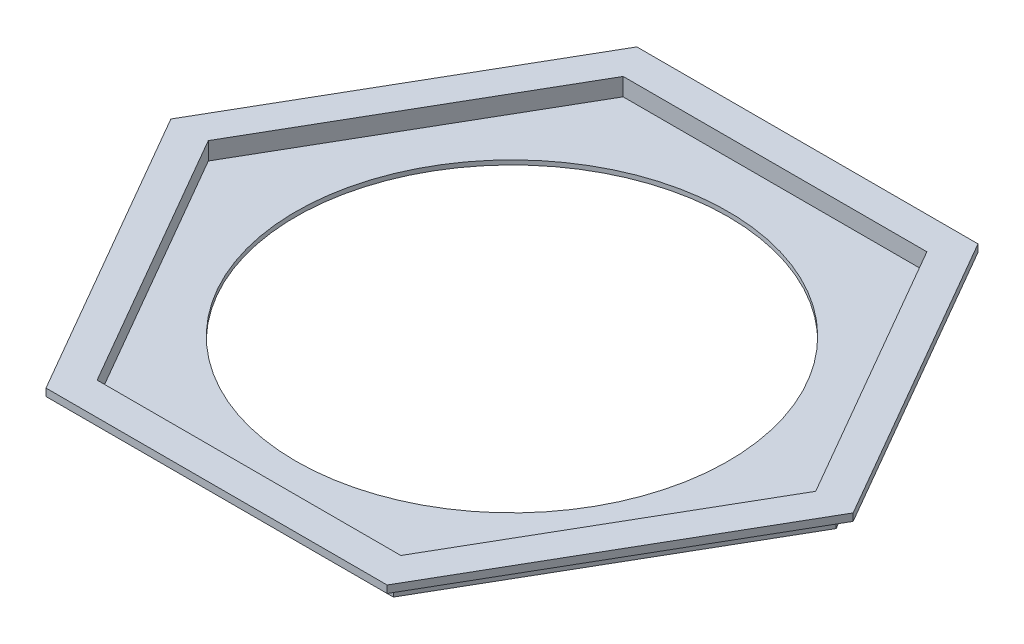
ISO-10303-21;
HEADER;
FILE_DESCRIPTION(('STEP AP214'),'2;1');
FILE_NAME('part.step','',(''),(''),'','','');
FILE_SCHEMA(('AUTOMOTIVE_DESIGN { 1 0 10303 214 1 1 1 1 }'));
ENDSEC;
DATA;
#1=APPLICATION_CONTEXT('core data for automotive mechanical design processes');
#2=APPLICATION_PROTOCOL_DEFINITION('international standard','automotive_design',2000,#1);
#3=PRODUCT_CONTEXT('',#1,'mechanical');
#4=PRODUCT('Part','Part','',(#3));
#5=PRODUCT_RELATED_PRODUCT_CATEGORY('part','',(#4));
#6=PRODUCT_DEFINITION_FORMATION('','',#4);
#7=PRODUCT_DEFINITION_CONTEXT('part definition',#1,'design');
#8=PRODUCT_DEFINITION('design','',#6,#7);
#9=PRODUCT_DEFINITION_SHAPE('','',#8);
#10=(LENGTH_UNIT() NAMED_UNIT(*) SI_UNIT(.MILLI.,.METRE.));
#11=(NAMED_UNIT(*) PLANE_ANGLE_UNIT() SI_UNIT($,.RADIAN.));
#12=(NAMED_UNIT(*) SI_UNIT($,.STERADIAN.) SOLID_ANGLE_UNIT());
#13=UNCERTAINTY_MEASURE_WITH_UNIT(LENGTH_MEASURE(1.E-05),#10,'distance_accuracy_value','');
#14=(GEOMETRIC_REPRESENTATION_CONTEXT(3) GLOBAL_UNCERTAINTY_ASSIGNED_CONTEXT((#13)) GLOBAL_UNIT_ASSIGNED_CONTEXT((#10,
#11,#12)) REPRESENTATION_CONTEXT('',''));
#15=CARTESIAN_POINT('',(0.,0.,0.));
#16=DIRECTION('',(0.,0.,1.));
#17=DIRECTION('',(1.,0.,0.));
#18=AXIS2_PLACEMENT_3D('',#15,#16,#17);
#19=CARTESIAN_POINT('',(0.,-25.,0.));
#20=DIRECTION('',(0.,1.,0.));
#21=DIRECTION('',(0.,0.,1.));
#22=AXIS2_PLACEMENT_3D('',#19,#20,#21);
#23=PLANE('',#22);
#24=DIRECTION('',(-1.,0.,0.));
#25=VECTOR('',#24,1.);
#26=CARTESIAN_POINT('',(578.86751,-25.,-1002.62793817089));
#27=LINE('',#26,#25);
#28=CARTESIAN_POINT('',(578.86751,-25.,-1002.62793817089));
#29=VERTEX_POINT('',#28);
#30=CARTESIAN_POINT('',(-578.86751,-25.,-1002.62793817089));
#31=VERTEX_POINT('',#30);
#32=EDGE_CURVE('E267',#29,#31,#27,.T.);
#33=ORIENTED_EDGE('',*,*,#32,.F.);
#34=DIRECTION('',(-0.5,0.,-0.866025403784439));
#35=VECTOR('',#34,1.);
#36=CARTESIAN_POINT('',(1157.73502,-25.,-1.06589177338339E-13));
#37=LINE('',#36,#35);
#38=CARTESIAN_POINT('',(1157.73502,-25.,-1.06589177338339E-13));
#39=VERTEX_POINT('',#38);
#40=EDGE_CURVE('E283',#39,#29,#37,.T.);
#41=ORIENTED_EDGE('',*,*,#40,.F.);
#42=DIRECTION('',(0.5,0.,-0.866025403784439));
#43=VECTOR('',#42,1.);
#44=CARTESIAN_POINT('',(578.86751,-25.,1002.62793817089));
#45=LINE('',#44,#43);
#46=CARTESIAN_POINT('',(578.86751,-25.,1002.62793817089));
#47=VERTEX_POINT('',#46);
#48=EDGE_CURVE('E280',#47,#39,#45,.T.);
#49=ORIENTED_EDGE('',*,*,#48,.F.);
#50=DIRECTION('',(1.,0.,0.));
#51=VECTOR('',#50,1.);
#52=CARTESIAN_POINT('',(-578.867509999999,-25.,1002.62793817089));
#53=LINE('',#52,#51);
#54=CARTESIAN_POINT('',(-578.867509999999,-25.,1002.62793817089));
#55=VERTEX_POINT('',#54);
#56=EDGE_CURVE('E277',#55,#47,#53,.T.);
#57=ORIENTED_EDGE('',*,*,#56,.F.);
#58=DIRECTION('',(0.5,0.,0.866025403784439));
#59=VECTOR('',#58,1.);
#60=CARTESIAN_POINT('',(-1157.73502,-25.,-1.4107940252668E-13));
#61=LINE('',#60,#59);
#62=CARTESIAN_POINT('',(-1157.73502,-25.,-1.4107940252668E-13));
#63=VERTEX_POINT('',#62);
#64=EDGE_CURVE('E274',#63,#55,#61,.T.);
#65=ORIENTED_EDGE('',*,*,#64,.F.);
#66=DIRECTION('',(-0.5,0.,0.866025403784439));
#67=VECTOR('',#66,1.);
#68=CARTESIAN_POINT('',(-578.86751,-25.,-1002.62793817089));
#69=LINE('',#68,#67);
#70=EDGE_CURVE('E270',#31,#63,#69,.T.);
#71=ORIENTED_EDGE('',*,*,#70,.F.);
#72=EDGE_LOOP('',(#33,#41,#49,#57,#65,#71));
#73=FACE_BOUND('',#72,.T.);
#74=DIRECTION('',(0.5,0.,-0.866025403784439));
#75=VECTOR('',#74,1.);
#76=CARTESIAN_POINT('',(-1099.99999308104,-25.,0.));
#77=LINE('',#76,#75);
#78=CARTESIAN_POINT('',(-1099.99999308104,-25.,0.));
#79=VERTEX_POINT('',#78);
#80=CARTESIAN_POINT('',(-549.999996540518,-25.,-952.627938170885));
#81=VERTEX_POINT('',#80);
#82=EDGE_CURVE('E61',#79,#81,#77,.T.);
#83=ORIENTED_EDGE('',*,*,#82,.F.);
#84=DIRECTION('',(-0.5,0.,-0.866025403784439));
#85=VECTOR('',#84,1.);
#86=CARTESIAN_POINT('',(-549.999996540518,-25.,952.627938170885));
#87=LINE('',#86,#85);
#88=CARTESIAN_POINT('',(-549.999996540518,-25.,952.627938170885));
#89=VERTEX_POINT('',#88);
#90=EDGE_CURVE('E224',#89,#79,#87,.T.);
#91=ORIENTED_EDGE('',*,*,#90,.F.);
#92=DIRECTION('',(-1.,0.,0.));
#93=VECTOR('',#92,1.);
#94=CARTESIAN_POINT('',(549.999996540519,-25.,952.627938170885));
#95=LINE('',#94,#93);
#96=CARTESIAN_POINT('',(549.999996540519,-25.,952.627938170885));
#97=VERTEX_POINT('',#96);
#98=EDGE_CURVE('E245',#97,#89,#95,.T.);
#99=ORIENTED_EDGE('',*,*,#98,.F.);
#100=DIRECTION('',(-0.5,0.,0.866025403784439));
#101=VECTOR('',#100,1.);
#102=CARTESIAN_POINT('',(1099.99999308104,-25.,0.));
#103=LINE('',#102,#101);
#104=CARTESIAN_POINT('',(1099.99999308104,-25.,0.));
#105=VERTEX_POINT('',#104);
#106=EDGE_CURVE('E242',#105,#97,#103,.T.);
#107=ORIENTED_EDGE('',*,*,#106,.F.);
#108=DIRECTION('',(0.5,0.,0.866025403784439));
#109=VECTOR('',#108,1.);
#110=CARTESIAN_POINT('',(549.999996540519,-25.,-952.627938170885));
#111=LINE('',#110,#109);
#112=CARTESIAN_POINT('',(549.999996540519,-25.,-952.627938170885));
#113=VERTEX_POINT('',#112);
#114=EDGE_CURVE('E239',#113,#105,#111,.T.);
#115=ORIENTED_EDGE('',*,*,#114,.F.);
#116=DIRECTION('',(1.,0.,0.));
#117=VECTOR('',#116,1.);
#118=CARTESIAN_POINT('',(-549.999996540518,-25.,-952.627938170885));
#119=LINE('',#118,#117);
#120=EDGE_CURVE('E236',#81,#113,#119,.T.);
#121=ORIENTED_EDGE('',*,*,#120,.F.);
#122=EDGE_LOOP('',(#83,#91,#99,#107,#115,#121));
#123=FACE_BOUND('',#122,.T.);
#124=ADVANCED_FACE('F36',(#73,#123),#23,.F.);
#125=CARTESIAN_POINT('',(578.86751,-25.,-1002.62793817089));
#126=DIRECTION('',(0.,0.,-1.));
#127=DIRECTION('',(-1.,0.,0.));
#128=AXIS2_PLACEMENT_3D('',#125,#126,#127);
#129=PLANE('',#128);
#130=DIRECTION('',(-1.,0.,0.));
#131=VECTOR('',#130,1.);
#132=CARTESIAN_POINT('',(578.86751,0.,-1002.62793817089));
#133=LINE('',#132,#131);
#134=CARTESIAN_POINT('',(578.86751,0.,-1002.62793817089));
#135=VERTEX_POINT('',#134);
#136=CARTESIAN_POINT('',(-578.86751,0.,-1002.62793817089));
#137=VERTEX_POINT('',#136);
#138=EDGE_CURVE('E266',#135,#137,#133,.T.);
#139=ORIENTED_EDGE('',*,*,#138,.F.);
#140=DIRECTION('',(0.,1.,0.));
#141=VECTOR('',#140,1.);
#142=CARTESIAN_POINT('',(578.86751,-25.,-1002.62793817089));
#143=LINE('',#142,#141);
#144=EDGE_CURVE('E11',#29,#135,#143,.T.);
#145=ORIENTED_EDGE('',*,*,#144,.F.);
#146=ORIENTED_EDGE('',*,*,#32,.T.);
#147=DIRECTION('',(0.,1.,0.));
#148=VECTOR('',#147,1.);
#149=CARTESIAN_POINT('',(-578.86751,-25.,-1002.62793817089));
#150=LINE('',#149,#148);
#151=EDGE_CURVE('E40',#31,#137,#150,.T.);
#152=ORIENTED_EDGE('',*,*,#151,.T.);
#153=EDGE_LOOP('',(#139,#145,#146,#152));
#154=FACE_BOUND('',#153,.T.);
#155=ADVANCED_FACE('F38',(#154),#129,.T.);
#156=CARTESIAN_POINT('',(1157.73502,-25.,-1.06589177338339E-13));
#157=DIRECTION('',(0.866025403784439,0.,-0.5));
#158=DIRECTION('',(-0.5,0.,-0.866025403784439));
#159=AXIS2_PLACEMENT_3D('',#156,#157,#158);
#160=PLANE('',#159);
#161=DIRECTION('',(-0.5,0.,-0.866025403784439));
#162=VECTOR('',#161,1.);
#163=CARTESIAN_POINT('',(1157.73502,0.,-1.06589177338339E-13));
#164=LINE('',#163,#162);
#165=CARTESIAN_POINT('',(1157.73502,0.,-1.06589177338339E-13));
#166=VERTEX_POINT('',#165);
#167=EDGE_CURVE('E271',#166,#135,#164,.T.);
#168=ORIENTED_EDGE('',*,*,#167,.F.);
#169=DIRECTION('',(0.,1.,0.));
#170=VECTOR('',#169,1.);
#171=CARTESIAN_POINT('',(1157.73502,-25.,-1.06589177338339E-13));
#172=LINE('',#171,#170);
#173=EDGE_CURVE('E45',#39,#166,#172,.T.);
#174=ORIENTED_EDGE('',*,*,#173,.F.);
#175=ORIENTED_EDGE('',*,*,#40,.T.);
#176=ORIENTED_EDGE('',*,*,#144,.T.);
#177=EDGE_LOOP('',(#168,#174,#175,#176));
#178=FACE_BOUND('',#177,.T.);
#179=ADVANCED_FACE('F320',(#178),#160,.T.);
#180=CARTESIAN_POINT('',(578.86751,-25.,1002.62793817089));
#181=DIRECTION('',(0.866025403784439,0.,0.5));
#182=DIRECTION('',(0.5,0.,-0.866025403784439));
#183=AXIS2_PLACEMENT_3D('',#180,#181,#182);
#184=PLANE('',#183);
#185=DIRECTION('',(0.5,0.,-0.866025403784439));
#186=VECTOR('',#185,1.);
#187=CARTESIAN_POINT('',(578.86751,0.,1002.62793817089));
#188=LINE('',#187,#186);
#189=CARTESIAN_POINT('',(578.86751,0.,1002.62793817089));
#190=VERTEX_POINT('',#189);
#191=EDGE_CURVE('E297',#190,#166,#188,.T.);
#192=ORIENTED_EDGE('',*,*,#191,.F.);
#193=DIRECTION('',(0.,1.,0.));
#194=VECTOR('',#193,1.);
#195=CARTESIAN_POINT('',(578.86751,-25.,1002.62793817089));
#196=LINE('',#195,#194);
#197=EDGE_CURVE('E303',#47,#190,#196,.T.);
#198=ORIENTED_EDGE('',*,*,#197,.F.);
#199=ORIENTED_EDGE('',*,*,#48,.T.);
#200=ORIENTED_EDGE('',*,*,#173,.T.);
#201=EDGE_LOOP('',(#192,#198,#199,#200));
#202=FACE_BOUND('',#201,.T.);
#203=ADVANCED_FACE('F332',(#202),#184,.T.);
#204=CARTESIAN_POINT('',(-578.867509999999,-25.,1002.62793817089));
#205=DIRECTION('',(0.,0.,1.));
#206=DIRECTION('',(1.,0.,0.));
#207=AXIS2_PLACEMENT_3D('',#204,#205,#206);
#208=PLANE('',#207);
#209=DIRECTION('',(1.,0.,0.));
#210=VECTOR('',#209,1.);
#211=CARTESIAN_POINT('',(-578.867509999999,0.,1002.62793817089));
#212=LINE('',#211,#210);
#213=CARTESIAN_POINT('',(-578.867509999999,0.,1002.62793817089));
#214=VERTEX_POINT('',#213);
#215=EDGE_CURVE('E294',#214,#190,#212,.T.);
#216=ORIENTED_EDGE('',*,*,#215,.F.);
#217=DIRECTION('',(0.,1.,0.));
#218=VECTOR('',#217,1.);
#219=CARTESIAN_POINT('',(-578.867509999999,-25.,1002.62793817089));
#220=LINE('',#219,#218);
#221=EDGE_CURVE('E305',#55,#214,#220,.T.);
#222=ORIENTED_EDGE('',*,*,#221,.F.);
#223=ORIENTED_EDGE('',*,*,#56,.T.);
#224=ORIENTED_EDGE('',*,*,#197,.T.);
#225=EDGE_LOOP('',(#216,#222,#223,#224));
#226=FACE_BOUND('',#225,.T.);
#227=ADVANCED_FACE('F330',(#226),#208,.T.);
#228=CARTESIAN_POINT('',(-1157.73502,-25.,-1.4107940252668E-13));
#229=DIRECTION('',(-0.866025403784439,0.,0.5));
#230=DIRECTION('',(0.5,0.,0.866025403784439));
#231=AXIS2_PLACEMENT_3D('',#228,#229,#230);
#232=PLANE('',#231);
#233=DIRECTION('',(0.5,0.,0.866025403784439));
#234=VECTOR('',#233,1.);
#235=CARTESIAN_POINT('',(-1157.73502,0.,-1.4107940252668E-13));
#236=LINE('',#235,#234);
#237=CARTESIAN_POINT('',(-1157.73502,0.,-1.4107940252668E-13));
#238=VERTEX_POINT('',#237);
#239=EDGE_CURVE('E291',#238,#214,#236,.T.);
#240=ORIENTED_EDGE('',*,*,#239,.F.);
#241=DIRECTION('',(0.,1.,0.));
#242=VECTOR('',#241,1.);
#243=CARTESIAN_POINT('',(-1157.73502,-25.,-1.4107940252668E-13));
#244=LINE('',#243,#242);
#245=EDGE_CURVE('E306',#63,#238,#244,.T.);
#246=ORIENTED_EDGE('',*,*,#245,.F.);
#247=ORIENTED_EDGE('',*,*,#64,.T.);
#248=ORIENTED_EDGE('',*,*,#221,.T.);
#249=EDGE_LOOP('',(#240,#246,#247,#248));
#250=FACE_BOUND('',#249,.T.);
#251=ADVANCED_FACE('F327',(#250),#232,.T.);
#252=CARTESIAN_POINT('',(-578.86751,-25.,-1002.62793817089));
#253=DIRECTION('',(-0.866025403784439,0.,-0.5));
#254=DIRECTION('',(-0.5,0.,0.866025403784439));
#255=AXIS2_PLACEMENT_3D('',#252,#253,#254);
#256=PLANE('',#255);
#257=DIRECTION('',(-0.5,0.,0.866025403784439));
#258=VECTOR('',#257,1.);
#259=CARTESIAN_POINT('',(-578.86751,0.,-1002.62793817089));
#260=LINE('',#259,#258);
#261=EDGE_CURVE('E288',#137,#238,#260,.T.);
#262=ORIENTED_EDGE('',*,*,#261,.F.);
#263=ORIENTED_EDGE('',*,*,#151,.F.);
#264=ORIENTED_EDGE('',*,*,#70,.T.);
#265=ORIENTED_EDGE('',*,*,#245,.T.);
#266=EDGE_LOOP('',(#262,#263,#264,#265));
#267=FACE_BOUND('',#266,.T.);
#268=ADVANCED_FACE('F314',(#267),#256,.T.);
#269=CARTESIAN_POINT('',(0.,0.,0.));
#270=DIRECTION('',(0.,1.,0.));
#271=DIRECTION('',(0.,0.,1.));
#272=AXIS2_PLACEMENT_3D('',#269,#270,#271);
#273=PLANE('',#272);
#274=DIRECTION('',(-0.5,0.,-0.866025403784439));
#275=VECTOR('',#274,1.);
#276=CARTESIAN_POINT('',(1030.71796077828,0.,0.));
#277=LINE('',#276,#275);
#278=CARTESIAN_POINT('',(1030.71796077828,0.,0.));
#279=VERTEX_POINT('',#278);
#280=CARTESIAN_POINT('',(515.358980389141,0.,-892.627938170885));
#281=VERTEX_POINT('',#280);
#282=EDGE_CURVE('E53',#279,#281,#277,.T.);
#283=ORIENTED_EDGE('',*,*,#282,.F.);
#284=DIRECTION('',(0.5,0.,-0.866025403784439));
#285=VECTOR('',#284,1.);
#286=CARTESIAN_POINT('',(515.358980389141,0.,892.627938170885));
#287=LINE('',#286,#285);
#288=CARTESIAN_POINT('',(515.358980389141,0.,892.627938170885));
#289=VERTEX_POINT('',#288);
#290=EDGE_CURVE('E183',#289,#279,#287,.T.);
#291=ORIENTED_EDGE('',*,*,#290,.F.);
#292=DIRECTION('',(1.,0.,0.));
#293=VECTOR('',#292,1.);
#294=CARTESIAN_POINT('',(-515.35898038914,0.,892.627938170885));
#295=LINE('',#294,#293);
#296=CARTESIAN_POINT('',(-515.35898038914,0.,892.627938170885));
#297=VERTEX_POINT('',#296);
#298=EDGE_CURVE('E186',#297,#289,#295,.T.);
#299=ORIENTED_EDGE('',*,*,#298,.F.);
#300=DIRECTION('',(0.5,0.,0.866025403784438));
#301=VECTOR('',#300,1.);
#302=CARTESIAN_POINT('',(-1030.71796077828,0.,-1.89153469686269E-13));
#303=LINE('',#302,#301);
#304=CARTESIAN_POINT('',(-1030.71796077828,0.,-1.89153469686269E-13));
#305=VERTEX_POINT('',#304);
#306=EDGE_CURVE('E206',#305,#297,#303,.T.);
#307=ORIENTED_EDGE('',*,*,#306,.F.);
#308=DIRECTION('',(-0.5,0.,0.866025403784439));
#309=VECTOR('',#308,1.);
#310=CARTESIAN_POINT('',(-515.358980389141,0.,-892.627938170885));
#311=LINE('',#310,#309);
#312=CARTESIAN_POINT('',(-515.358980389141,0.,-892.627938170885));
#313=VERTEX_POINT('',#312);
#314=EDGE_CURVE('E203',#313,#305,#311,.T.);
#315=ORIENTED_EDGE('',*,*,#314,.F.);
#316=DIRECTION('',(-1.,0.,0.));
#317=VECTOR('',#316,1.);
#318=CARTESIAN_POINT('',(515.358980389141,0.,-892.627938170885));
#319=LINE('',#318,#317);
#320=EDGE_CURVE('E200',#281,#313,#319,.T.);
#321=ORIENTED_EDGE('',*,*,#320,.F.);
#322=EDGE_LOOP('',(#283,#291,#299,#307,#315,#321));
#323=FACE_BOUND('',#322,.T.);
#324=ORIENTED_EDGE('',*,*,#138,.T.);
#325=ORIENTED_EDGE('',*,*,#261,.T.);
#326=ORIENTED_EDGE('',*,*,#239,.T.);
#327=ORIENTED_EDGE('',*,*,#215,.T.);
#328=ORIENTED_EDGE('',*,*,#191,.T.);
#329=ORIENTED_EDGE('',*,*,#167,.T.);
#330=EDGE_LOOP('',(#324,#325,#326,#327,#328,#329));
#331=FACE_BOUND('',#330,.T.);
#332=ADVANCED_FACE('F316',(#323,#331),#273,.T.);
#333=CARTESIAN_POINT('',(-1099.99999308104,-75.,0.));
#334=DIRECTION('',(0.866025403784438,0.,0.5));
#335=DIRECTION('',(0.5,0.,-0.866025403784438));
#336=AXIS2_PLACEMENT_3D('',#333,#334,#335);
#337=PLANE('',#336);
#338=ORIENTED_EDGE('',*,*,#82,.T.);
#339=DIRECTION('',(0.,1.,0.));
#340=VECTOR('',#339,1.);
#341=CARTESIAN_POINT('',(-549.999996540518,-75.,-952.627938170885));
#342=LINE('',#341,#340);
#343=CARTESIAN_POINT('',(-549.999996540518,-75.,-952.627938170885));
#344=VERTEX_POINT('',#343);
#345=EDGE_CURVE('E263',#344,#81,#342,.T.);
#346=ORIENTED_EDGE('',*,*,#345,.F.);
#347=DIRECTION('',(0.5,0.,-0.866025403784439));
#348=VECTOR('',#347,1.);
#349=CARTESIAN_POINT('',(-1099.99999308104,-75.,0.));
#350=LINE('',#349,#348);
#351=CARTESIAN_POINT('',(-1099.99999308104,-75.,0.));
#352=VERTEX_POINT('',#351);
#353=EDGE_CURVE('E220',#352,#344,#350,.T.);
#354=ORIENTED_EDGE('',*,*,#353,.F.);
#355=DIRECTION('',(0.,1.,0.));
#356=VECTOR('',#355,1.);
#357=CARTESIAN_POINT('',(-1099.99999308104,-75.,0.));
#358=LINE('',#357,#356);
#359=EDGE_CURVE('E234',#352,#79,#358,.T.);
#360=ORIENTED_EDGE('',*,*,#359,.T.);
#361=EDGE_LOOP('',(#338,#346,#354,#360));
#362=FACE_BOUND('',#361,.T.);
#363=ADVANCED_FACE('F348',(#362),#337,.F.);
#364=CARTESIAN_POINT('',(-549.999996540518,-75.,-952.627938170885));
#365=DIRECTION('',(0.,0.,1.));
#366=DIRECTION('',(1.,0.,0.));
#367=AXIS2_PLACEMENT_3D('',#364,#365,#366);
#368=PLANE('',#367);
#369=ORIENTED_EDGE('',*,*,#120,.T.);
#370=DIRECTION('',(0.,1.,0.));
#371=VECTOR('',#370,1.);
#372=CARTESIAN_POINT('',(549.999996540519,-75.,-952.627938170885));
#373=LINE('',#372,#371);
#374=CARTESIAN_POINT('',(549.999996540519,-75.,-952.627938170885));
#375=VERTEX_POINT('',#374);
#376=EDGE_CURVE('E260',#375,#113,#373,.T.);
#377=ORIENTED_EDGE('',*,*,#376,.F.);
#378=DIRECTION('',(1.,0.,0.));
#379=VECTOR('',#378,1.);
#380=CARTESIAN_POINT('',(-549.999996540518,-75.,-952.627938170885));
#381=LINE('',#380,#379);
#382=EDGE_CURVE('E223',#344,#375,#381,.T.);
#383=ORIENTED_EDGE('',*,*,#382,.F.);
#384=ORIENTED_EDGE('',*,*,#345,.T.);
#385=EDGE_LOOP('',(#369,#377,#383,#384));
#386=FACE_BOUND('',#385,.T.);
#387=ADVANCED_FACE('F356',(#386),#368,.F.);
#388=CARTESIAN_POINT('',(549.999996540519,-75.,-952.627938170885));
#389=DIRECTION('',(-0.866025403784439,0.,0.5));
#390=DIRECTION('',(0.5,0.,0.866025403784439));
#391=AXIS2_PLACEMENT_3D('',#388,#389,#390);
#392=PLANE('',#391);
#393=ORIENTED_EDGE('',*,*,#114,.T.);
#394=DIRECTION('',(0.,1.,0.));
#395=VECTOR('',#394,1.);
#396=CARTESIAN_POINT('',(1099.99999308104,-75.,0.));
#397=LINE('',#396,#395);
#398=CARTESIAN_POINT('',(1099.99999308104,-75.,0.));
#399=VERTEX_POINT('',#398);
#400=EDGE_CURVE('E257',#399,#105,#397,.T.);
#401=ORIENTED_EDGE('',*,*,#400,.F.);
#402=DIRECTION('',(0.5,0.,0.866025403784439));
#403=VECTOR('',#402,1.);
#404=CARTESIAN_POINT('',(549.999996540519,-75.,-952.627938170885));
#405=LINE('',#404,#403);
#406=EDGE_CURVE('E226',#375,#399,#405,.T.);
#407=ORIENTED_EDGE('',*,*,#406,.F.);
#408=ORIENTED_EDGE('',*,*,#376,.T.);
#409=EDGE_LOOP('',(#393,#401,#407,#408));
#410=FACE_BOUND('',#409,.T.);
#411=ADVANCED_FACE('F404',(#410),#392,.F.);
#412=CARTESIAN_POINT('',(1099.99999308104,-75.,0.));
#413=DIRECTION('',(-0.866025403784439,0.,-0.5));
#414=DIRECTION('',(-0.5,0.,0.866025403784439));
#415=AXIS2_PLACEMENT_3D('',#412,#413,#414);
#416=PLANE('',#415);
#417=ORIENTED_EDGE('',*,*,#106,.T.);
#418=DIRECTION('',(0.,1.,0.));
#419=VECTOR('',#418,1.);
#420=CARTESIAN_POINT('',(549.999996540519,-75.,952.627938170885));
#421=LINE('',#420,#419);
#422=CARTESIAN_POINT('',(549.999996540519,-75.,952.627938170885));
#423=VERTEX_POINT('',#422);
#424=EDGE_CURVE('E254',#423,#97,#421,.T.);
#425=ORIENTED_EDGE('',*,*,#424,.F.);
#426=DIRECTION('',(-0.5,0.,0.866025403784439));
#427=VECTOR('',#426,1.);
#428=CARTESIAN_POINT('',(1099.99999308104,-75.,0.));
#429=LINE('',#428,#427);
#430=EDGE_CURVE('E228',#399,#423,#429,.T.);
#431=ORIENTED_EDGE('',*,*,#430,.F.);
#432=ORIENTED_EDGE('',*,*,#400,.T.);
#433=EDGE_LOOP('',(#417,#425,#431,#432));
#434=FACE_BOUND('',#433,.T.);
#435=ADVANCED_FACE('F400',(#434),#416,.F.);
#436=CARTESIAN_POINT('',(549.999996540519,-75.,952.627938170885));
#437=DIRECTION('',(0.,0.,-1.));
#438=DIRECTION('',(-1.,0.,0.));
#439=AXIS2_PLACEMENT_3D('',#436,#437,#438);
#440=PLANE('',#439);
#441=ORIENTED_EDGE('',*,*,#98,.T.);
#442=DIRECTION('',(0.,1.,0.));
#443=VECTOR('',#442,1.);
#444=CARTESIAN_POINT('',(-549.999996540518,-75.,952.627938170885));
#445=LINE('',#444,#443);
#446=CARTESIAN_POINT('',(-549.999996540518,-75.,952.627938170885));
#447=VERTEX_POINT('',#446);
#448=EDGE_CURVE('E251',#447,#89,#445,.T.);
#449=ORIENTED_EDGE('',*,*,#448,.F.);
#450=DIRECTION('',(-1.,0.,0.));
#451=VECTOR('',#450,1.);
#452=CARTESIAN_POINT('',(549.999996540519,-75.,952.627938170885));
#453=LINE('',#452,#451);
#454=EDGE_CURVE('E230',#423,#447,#453,.T.);
#455=ORIENTED_EDGE('',*,*,#454,.F.);
#456=ORIENTED_EDGE('',*,*,#424,.T.);
#457=EDGE_LOOP('',(#441,#449,#455,#456));
#458=FACE_BOUND('',#457,.T.);
#459=ADVANCED_FACE('F396',(#458),#440,.F.);
#460=CARTESIAN_POINT('',(-549.999996540518,-75.,952.627938170885));
#461=DIRECTION('',(0.866025403784439,0.,-0.5));
#462=DIRECTION('',(-0.5,0.,-0.866025403784439));
#463=AXIS2_PLACEMENT_3D('',#460,#461,#462);
#464=PLANE('',#463);
#465=ORIENTED_EDGE('',*,*,#90,.T.);
#466=ORIENTED_EDGE('',*,*,#359,.F.);
#467=DIRECTION('',(-0.5,0.,-0.866025403784439));
#468=VECTOR('',#467,1.);
#469=CARTESIAN_POINT('',(-549.999996540518,-75.,952.627938170885));
#470=LINE('',#469,#468);
#471=EDGE_CURVE('E232',#447,#352,#470,.T.);
#472=ORIENTED_EDGE('',*,*,#471,.F.);
#473=ORIENTED_EDGE('',*,*,#448,.T.);
#474=EDGE_LOOP('',(#465,#466,#472,#473));
#475=FACE_BOUND('',#474,.T.);
#476=ADVANCED_FACE('F392',(#475),#464,.F.);
#477=CARTESIAN_POINT('',(0.,-75.,0.));
#478=DIRECTION('',(0.,-1.,0.));
#479=DIRECTION('',(0.,0.,-1.));
#480=AXIS2_PLACEMENT_3D('',#477,#478,#479);
#481=PLANE('',#480);
#482=CARTESIAN_POINT('',(0.,-75.,0.));
#483=DIRECTION('',(0.,-1.,0.));
#484=DIRECTION('',(0.,0.,-1.));
#485=AXIS2_PLACEMENT_3D('',#482,#483,#484);
#486=CIRCLE('',#485,733.663605778282);
#487=CARTESIAN_POINT('',(0.,-75.,-733.663605778282));
#488=VERTEX_POINT('',#487);
#489=EDGE_CURVE('E189',#488,#488,#486,.F.);
#490=ORIENTED_EDGE('',*,*,#489,.T.);
#491=EDGE_LOOP('',(#490));
#492=FACE_BOUND('',#491,.T.);
#493=ORIENTED_EDGE('',*,*,#353,.T.);
#494=ORIENTED_EDGE('',*,*,#382,.T.);
#495=ORIENTED_EDGE('',*,*,#406,.T.);
#496=ORIENTED_EDGE('',*,*,#430,.T.);
#497=ORIENTED_EDGE('',*,*,#454,.T.);
#498=ORIENTED_EDGE('',*,*,#471,.T.);
#499=EDGE_LOOP('',(#493,#494,#495,#496,#497,#498));
#500=FACE_BOUND('',#499,.T.);
#501=ADVANCED_FACE('F379',(#492,#500),#481,.T.);
#502=CARTESIAN_POINT('',(1030.71796077828,-60.,0.));
#503=DIRECTION('',(0.866025403784439,0.,-0.5));
#504=DIRECTION('',(-0.5,0.,-0.866025403784439));
#505=AXIS2_PLACEMENT_3D('',#502,#503,#504);
#506=PLANE('',#505);
#507=ORIENTED_EDGE('',*,*,#282,.T.);
#508=DIRECTION('',(0.,1.,0.));
#509=VECTOR('',#508,1.);
#510=CARTESIAN_POINT('',(515.358980389141,-60.,-892.627938170885));
#511=LINE('',#510,#509);
#512=CARTESIAN_POINT('',(515.358980389141,-60.,-892.627938170885));
#513=VERTEX_POINT('',#512);
#514=EDGE_CURVE('E160',#513,#281,#511,.T.);
#515=ORIENTED_EDGE('',*,*,#514,.F.);
#516=DIRECTION('',(-0.5,0.,-0.866025403784439));
#517=VECTOR('',#516,1.);
#518=CARTESIAN_POINT('',(1030.71796077828,-60.,0.));
#519=LINE('',#518,#517);
#520=CARTESIAN_POINT('',(1030.71796077828,-60.,0.));
#521=VERTEX_POINT('',#520);
#522=EDGE_CURVE('E164',#521,#513,#519,.T.);
#523=ORIENTED_EDGE('',*,*,#522,.F.);
#524=DIRECTION('',(0.,1.,0.));
#525=VECTOR('',#524,1.);
#526=CARTESIAN_POINT('',(1030.71796077828,-60.,0.));
#527=LINE('',#526,#525);
#528=EDGE_CURVE('E211',#521,#279,#527,.T.);
#529=ORIENTED_EDGE('',*,*,#528,.T.);
#530=EDGE_LOOP('',(#507,#515,#523,#529));
#531=FACE_BOUND('',#530,.T.);
#532=ADVANCED_FACE('F162',(#531),#506,.F.);
#533=CARTESIAN_POINT('',(515.358980389141,-60.,892.627938170885));
#534=DIRECTION('',(0.866025403784439,0.,0.5));
#535=DIRECTION('',(0.5,0.,-0.866025403784439));
#536=AXIS2_PLACEMENT_3D('',#533,#534,#535);
#537=PLANE('',#536);
#538=ORIENTED_EDGE('',*,*,#290,.T.);
#539=ORIENTED_EDGE('',*,*,#528,.F.);
#540=DIRECTION('',(0.5,0.,-0.866025403784439));
#541=VECTOR('',#540,1.);
#542=CARTESIAN_POINT('',(515.358980389141,-60.,892.627938170885));
#543=LINE('',#542,#541);
#544=CARTESIAN_POINT('',(515.358980389141,-60.,892.627938170885));
#545=VERTEX_POINT('',#544);
#546=EDGE_CURVE('E170',#545,#521,#543,.T.);
#547=ORIENTED_EDGE('',*,*,#546,.F.);
#548=DIRECTION('',(0.,1.,0.));
#549=VECTOR('',#548,1.);
#550=CARTESIAN_POINT('',(515.358980389141,-60.,892.627938170885));
#551=LINE('',#550,#549);
#552=EDGE_CURVE('E213',#545,#289,#551,.T.);
#553=ORIENTED_EDGE('',*,*,#552,.T.);
#554=EDGE_LOOP('',(#538,#539,#547,#553));
#555=FACE_BOUND('',#554,.T.);
#556=ADVANCED_FACE('F371',(#555),#537,.F.);
#557=CARTESIAN_POINT('',(-515.35898038914,-60.,892.627938170885));
#558=DIRECTION('',(0.,0.,1.));
#559=DIRECTION('',(1.,0.,0.));
#560=AXIS2_PLACEMENT_3D('',#557,#558,#559);
#561=PLANE('',#560);
#562=ORIENTED_EDGE('',*,*,#298,.T.);
#563=ORIENTED_EDGE('',*,*,#552,.F.);
#564=DIRECTION('',(1.,0.,0.));
#565=VECTOR('',#564,1.);
#566=CARTESIAN_POINT('',(-515.35898038914,-60.,892.627938170885));
#567=LINE('',#566,#565);
#568=CARTESIAN_POINT('',(-515.35898038914,-60.,892.627938170885));
#569=VERTEX_POINT('',#568);
#570=EDGE_CURVE('E196',#569,#545,#567,.T.);
#571=ORIENTED_EDGE('',*,*,#570,.F.);
#572=DIRECTION('',(0.,1.,0.));
#573=VECTOR('',#572,1.);
#574=CARTESIAN_POINT('',(-515.35898038914,-60.,892.627938170885));
#575=LINE('',#574,#573);
#576=EDGE_CURVE('E215',#569,#297,#575,.T.);
#577=ORIENTED_EDGE('',*,*,#576,.T.);
#578=EDGE_LOOP('',(#562,#563,#571,#577));
#579=FACE_BOUND('',#578,.T.);
#580=ADVANCED_FACE('F369',(#579),#561,.F.);
#581=CARTESIAN_POINT('',(-1030.71796077828,-60.,-1.89153469686269E-13));
#582=DIRECTION('',(-0.866025403784438,0.,0.5));
#583=DIRECTION('',(0.5,0.,0.866025403784439));
#584=AXIS2_PLACEMENT_3D('',#581,#582,#583);
#585=PLANE('',#584);
#586=ORIENTED_EDGE('',*,*,#306,.T.);
#587=ORIENTED_EDGE('',*,*,#576,.F.);
#588=DIRECTION('',(0.5,0.,0.866025403784438));
#589=VECTOR('',#588,1.);
#590=CARTESIAN_POINT('',(-1030.71796077828,-60.,-1.89153469686269E-13));
#591=LINE('',#590,#589);
#592=CARTESIAN_POINT('',(-1030.71796077828,-60.,-1.89153469686269E-13));
#593=VERTEX_POINT('',#592);
#594=EDGE_CURVE('E193',#593,#569,#591,.T.);
#595=ORIENTED_EDGE('',*,*,#594,.F.);
#596=DIRECTION('',(0.,1.,0.));
#597=VECTOR('',#596,1.);
#598=CARTESIAN_POINT('',(-1030.71796077828,-60.,-1.89153469686269E-13));
#599=LINE('',#598,#597);
#600=EDGE_CURVE('E217',#593,#305,#599,.T.);
#601=ORIENTED_EDGE('',*,*,#600,.T.);
#602=EDGE_LOOP('',(#586,#587,#595,#601));
#603=FACE_BOUND('',#602,.T.);
#604=ADVANCED_FACE('F367',(#603),#585,.F.);
#605=CARTESIAN_POINT('',(-515.358980389141,-60.,-892.627938170885));
#606=DIRECTION('',(-0.866025403784439,0.,-0.5));
#607=DIRECTION('',(-0.5,0.,0.866025403784439));
#608=AXIS2_PLACEMENT_3D('',#605,#606,#607);
#609=PLANE('',#608);
#610=ORIENTED_EDGE('',*,*,#314,.T.);
#611=ORIENTED_EDGE('',*,*,#600,.F.);
#612=DIRECTION('',(-0.5,0.,0.866025403784439));
#613=VECTOR('',#612,1.);
#614=CARTESIAN_POINT('',(-515.358980389141,-60.,-892.627938170885));
#615=LINE('',#614,#613);
#616=CARTESIAN_POINT('',(-515.358980389141,-60.,-892.627938170885));
#617=VERTEX_POINT('',#616);
#618=EDGE_CURVE('E178',#617,#593,#615,.T.);
#619=ORIENTED_EDGE('',*,*,#618,.F.);
#620=DIRECTION('',(0.,1.,0.));
#621=VECTOR('',#620,1.);
#622=CARTESIAN_POINT('',(-515.358980389141,-60.,-892.627938170885));
#623=LINE('',#622,#621);
#624=EDGE_CURVE('E169',#617,#313,#623,.T.);
#625=ORIENTED_EDGE('',*,*,#624,.T.);
#626=EDGE_LOOP('',(#610,#611,#619,#625));
#627=FACE_BOUND('',#626,.T.);
#628=ADVANCED_FACE('F363',(#627),#609,.F.);
#629=CARTESIAN_POINT('',(515.358980389141,-60.,-892.627938170885));
#630=DIRECTION('',(0.,0.,-1.));
#631=DIRECTION('',(-1.,0.,0.));
#632=AXIS2_PLACEMENT_3D('',#629,#630,#631);
#633=PLANE('',#632);
#634=ORIENTED_EDGE('',*,*,#320,.T.);
#635=ORIENTED_EDGE('',*,*,#624,.F.);
#636=DIRECTION('',(-1.,0.,0.));
#637=VECTOR('',#636,1.);
#638=CARTESIAN_POINT('',(515.358980389141,-60.,-892.627938170885));
#639=LINE('',#638,#637);
#640=EDGE_CURVE('E173',#513,#617,#639,.T.);
#641=ORIENTED_EDGE('',*,*,#640,.F.);
#642=ORIENTED_EDGE('',*,*,#514,.T.);
#643=EDGE_LOOP('',(#634,#635,#641,#642));
#644=FACE_BOUND('',#643,.T.);
#645=ADVANCED_FACE('F174',(#644),#633,.F.);
#646=CARTESIAN_POINT('',(0.,-60.,0.));
#647=DIRECTION('',(0.,1.,0.));
#648=DIRECTION('',(0.,0.,1.));
#649=AXIS2_PLACEMENT_3D('',#646,#647,#648);
#650=PLANE('',#649);
#651=CARTESIAN_POINT('',(0.,-60.,0.));
#652=DIRECTION('',(0.,1.,0.));
#653=DIRECTION('',(0.,0.,1.));
#654=AXIS2_PLACEMENT_3D('',#651,#652,#653);
#655=CIRCLE('',#654,733.663605778282);
#656=CARTESIAN_POINT('',(0.,-60.,733.663605778282));
#657=VERTEX_POINT('',#656);
#658=EDGE_CURVE('E201',#657,#657,#655,.T.);
#659=ORIENTED_EDGE('',*,*,#658,.F.);
#660=EDGE_LOOP('',(#659));
#661=FACE_BOUND('',#660,.T.);
#662=ORIENTED_EDGE('',*,*,#522,.T.);
#663=ORIENTED_EDGE('',*,*,#640,.T.);
#664=ORIENTED_EDGE('',*,*,#618,.T.);
#665=ORIENTED_EDGE('',*,*,#594,.T.);
#666=ORIENTED_EDGE('',*,*,#570,.T.);
#667=ORIENTED_EDGE('',*,*,#546,.T.);
#668=EDGE_LOOP('',(#662,#663,#664,#665,#666,#667));
#669=FACE_BOUND('',#668,.T.);
#670=ADVANCED_FACE('F180',(#661,#669),#650,.T.);
#671=CARTESIAN_POINT('',(0.,-75.001,0.));
#672=DIRECTION('',(0.,1.,0.));
#673=DIRECTION('',(0.,0.,1.));
#674=AXIS2_PLACEMENT_3D('',#671,#672,#673);
#675=CYLINDRICAL_SURFACE('',#674,733.663605778282);
#676=ORIENTED_EDGE('',*,*,#489,.F.);
#677=EDGE_LOOP('',(#676));
#678=FACE_BOUND('',#677,.T.);
#679=ORIENTED_EDGE('',*,*,#658,.T.);
#680=EDGE_LOOP('',(#679));
#681=FACE_BOUND('',#680,.T.);
#682=ADVANCED_FACE('F489',(#678,#681),#675,.F.);
#683=CLOSED_SHELL('',(#124,#155,#179,#203,#227,#251,#268,#332,#363,#387,#411,#435,#459,#476,
#501,#532,#556,#580,#604,#628,#645,#670,#682));
#684=MANIFOLD_SOLID_BREP('B2',#683);
#685=ADVANCED_BREP_SHAPE_REPRESENTATION('',(#18,#684),#14);
#686=SHAPE_DEFINITION_REPRESENTATION(#9,#685);
ENDSEC;
END-ISO-10303-21;
